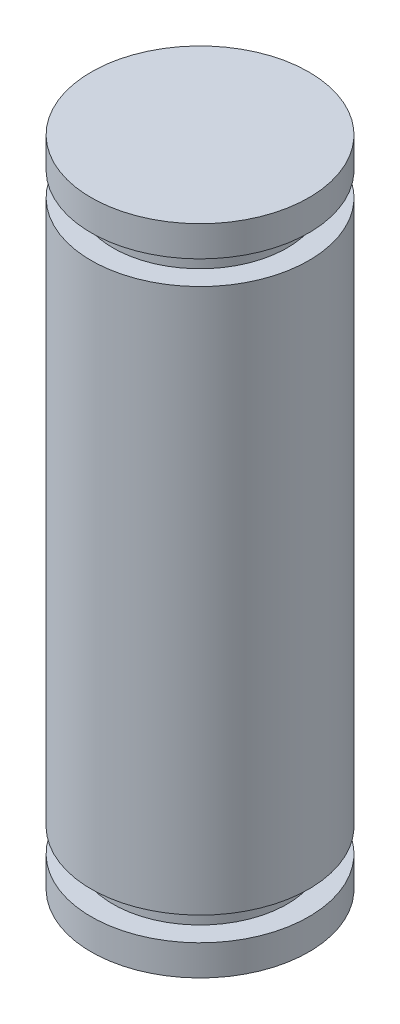
ISO-10303-21;
HEADER;
FILE_DESCRIPTION(('STEP AP214'),'2;1');
FILE_NAME('part.step','',(''),(''),'','','');
FILE_SCHEMA(('AUTOMOTIVE_DESIGN { 1 0 10303 214 1 1 1 1 }'));
ENDSEC;
DATA;
#1=APPLICATION_CONTEXT('core data for automotive mechanical design processes');
#2=APPLICATION_PROTOCOL_DEFINITION('international standard','automotive_design',2000,#1);
#3=PRODUCT_CONTEXT('',#1,'mechanical');
#4=PRODUCT('Part','Part','',(#3));
#5=PRODUCT_RELATED_PRODUCT_CATEGORY('part','',(#4));
#6=PRODUCT_DEFINITION_FORMATION('','',#4);
#7=PRODUCT_DEFINITION_CONTEXT('part definition',#1,'design');
#8=PRODUCT_DEFINITION('design','',#6,#7);
#9=PRODUCT_DEFINITION_SHAPE('','',#8);
#10=(LENGTH_UNIT() NAMED_UNIT(*) SI_UNIT(.MILLI.,.METRE.));
#11=(NAMED_UNIT(*) PLANE_ANGLE_UNIT() SI_UNIT($,.RADIAN.));
#12=(NAMED_UNIT(*) SI_UNIT($,.STERADIAN.) SOLID_ANGLE_UNIT());
#13=UNCERTAINTY_MEASURE_WITH_UNIT(LENGTH_MEASURE(1.E-05),#10,'distance_accuracy_value','');
#14=(GEOMETRIC_REPRESENTATION_CONTEXT(3) GLOBAL_UNCERTAINTY_ASSIGNED_CONTEXT((#13)) GLOBAL_UNIT_ASSIGNED_CONTEXT((#10,
#11,#12)) REPRESENTATION_CONTEXT('',''));
#15=CARTESIAN_POINT('',(0.,0.,0.));
#16=DIRECTION('',(0.,0.,1.));
#17=DIRECTION('',(1.,0.,0.));
#18=AXIS2_PLACEMENT_3D('',#15,#16,#17);
#19=CARTESIAN_POINT('',(0.,0.,0.));
#20=DIRECTION('',(0.,1.,0.));
#21=DIRECTION('',(0.,0.,1.));
#22=AXIS2_PLACEMENT_3D('',#19,#20,#21);
#23=PLANE('',#22);
#24=CARTESIAN_POINT('',(0.,0.,0.));
#25=DIRECTION('',(0.,-1.,0.));
#26=DIRECTION('',(0.,0.,-1.));
#27=AXIS2_PLACEMENT_3D('',#24,#25,#26);
#28=CIRCLE('',#27,5.);
#29=CARTESIAN_POINT('',(0.,0.,-5.));
#30=VERTEX_POINT('',#29);
#31=EDGE_CURVE('E10',#30,#30,#28,.T.);
#32=ORIENTED_EDGE('',*,*,#31,.T.);
#33=EDGE_LOOP('',(#32));
#34=FACE_BOUND('',#33,.T.);
#35=ADVANCED_FACE('F37',(#34),#23,.F.);
#36=CARTESIAN_POINT('',(0.,0.,0.));
#37=DIRECTION('',(0.,-1.,0.));
#38=DIRECTION('',(0.,0.,-1.));
#39=AXIS2_PLACEMENT_3D('',#36,#37,#38);
#40=CYLINDRICAL_SURFACE('',#39,5.);
#41=ORIENTED_EDGE('',*,*,#31,.F.);
#42=EDGE_LOOP('',(#41));
#43=FACE_BOUND('',#42,.T.);
#44=CARTESIAN_POINT('',(0.,1.4,0.));
#45=DIRECTION('',(0.,-1.,0.));
#46=DIRECTION('',(0.,0.,-1.));
#47=AXIS2_PLACEMENT_3D('',#44,#45,#46);
#48=CIRCLE('',#47,5.);
#49=CARTESIAN_POINT('',(0.,1.4,-5.));
#50=VERTEX_POINT('',#49);
#51=EDGE_CURVE('E44',#50,#50,#48,.T.);
#52=ORIENTED_EDGE('',*,*,#51,.T.);
#53=EDGE_LOOP('',(#52));
#54=FACE_BOUND('',#53,.T.);
#55=ADVANCED_FACE('F97',(#43,#54),#40,.T.);
#56=CARTESIAN_POINT('',(-5.,1.4,0.));
#57=DIRECTION('',(0.,-1.,0.));
#58=DIRECTION('',(0.,0.,-1.));
#59=AXIS2_PLACEMENT_3D('',#56,#57,#58);
#60=PLANE('',#59);
#61=ORIENTED_EDGE('',*,*,#51,.F.);
#62=EDGE_LOOP('',(#61));
#63=FACE_BOUND('',#62,.T.);
#64=CARTESIAN_POINT('',(0.,1.4,0.));
#65=DIRECTION('',(0.,-1.,0.));
#66=DIRECTION('',(0.,0.,-1.));
#67=AXIS2_PLACEMENT_3D('',#64,#65,#66);
#68=CIRCLE('',#67,4.);
#69=CARTESIAN_POINT('',(0.,1.4,-4.));
#70=VERTEX_POINT('',#69);
#71=EDGE_CURVE('E49',#70,#70,#68,.T.);
#72=ORIENTED_EDGE('',*,*,#71,.T.);
#73=EDGE_LOOP('',(#72));
#74=FACE_BOUND('',#73,.T.);
#75=ADVANCED_FACE('F101',(#63,#74),#60,.F.);
#76=CARTESIAN_POINT('',(0.,0.,0.));
#77=DIRECTION('',(0.,-1.,0.));
#78=DIRECTION('',(0.,0.,-1.));
#79=AXIS2_PLACEMENT_3D('',#76,#77,#78);
#80=CYLINDRICAL_SURFACE('',#79,4.);
#81=ORIENTED_EDGE('',*,*,#71,.F.);
#82=EDGE_LOOP('',(#81));
#83=FACE_BOUND('',#82,.T.);
#84=CARTESIAN_POINT('',(0.,2.5,0.));
#85=DIRECTION('',(0.,-1.,0.));
#86=DIRECTION('',(0.,0.,-1.));
#87=AXIS2_PLACEMENT_3D('',#84,#85,#86);
#88=CIRCLE('',#87,4.);
#89=CARTESIAN_POINT('',(0.,2.5,-4.));
#90=VERTEX_POINT('',#89);
#91=EDGE_CURVE('E54',#90,#90,#88,.T.);
#92=ORIENTED_EDGE('',*,*,#91,.T.);
#93=EDGE_LOOP('',(#92));
#94=FACE_BOUND('',#93,.T.);
#95=ADVANCED_FACE('F106',(#83,#94),#80,.T.);
#96=CARTESIAN_POINT('',(-4.,2.5,0.));
#97=DIRECTION('',(0.,1.,0.));
#98=DIRECTION('',(0.,0.,1.));
#99=AXIS2_PLACEMENT_3D('',#96,#97,#98);
#100=PLANE('',#99);
#101=ORIENTED_EDGE('',*,*,#91,.F.);
#102=EDGE_LOOP('',(#101));
#103=FACE_BOUND('',#102,.T.);
#104=CARTESIAN_POINT('',(0.,2.49999999999999,0.));
#105=DIRECTION('',(0.,-1.,0.));
#106=DIRECTION('',(0.,0.,-1.));
#107=AXIS2_PLACEMENT_3D('',#104,#105,#106);
#108=CIRCLE('',#107,5.);
#109=CARTESIAN_POINT('',(0.,2.49999999999999,-5.));
#110=VERTEX_POINT('',#109);
#111=EDGE_CURVE('E60',#110,#110,#108,.T.);
#112=ORIENTED_EDGE('',*,*,#111,.T.);
#113=EDGE_LOOP('',(#112));
#114=FACE_BOUND('',#113,.T.);
#115=ADVANCED_FACE('F112',(#103,#114),#100,.F.);
#116=CARTESIAN_POINT('',(0.,0.,0.));
#117=DIRECTION('',(0.,-1.,0.));
#118=DIRECTION('',(0.,0.,-1.));
#119=AXIS2_PLACEMENT_3D('',#116,#117,#118);
#120=CYLINDRICAL_SURFACE('',#119,5.);
#121=ORIENTED_EDGE('',*,*,#111,.F.);
#122=EDGE_LOOP('',(#121));
#123=FACE_BOUND('',#122,.T.);
#124=CARTESIAN_POINT('',(0.,27.5,0.));
#125=DIRECTION('',(0.,-1.,0.));
#126=DIRECTION('',(0.,0.,-1.));
#127=AXIS2_PLACEMENT_3D('',#124,#125,#126);
#128=CIRCLE('',#127,5.);
#129=CARTESIAN_POINT('',(0.,27.5,-5.));
#130=VERTEX_POINT('',#129);
#131=EDGE_CURVE('E64',#130,#130,#128,.T.);
#132=ORIENTED_EDGE('',*,*,#131,.T.);
#133=EDGE_LOOP('',(#132));
#134=FACE_BOUND('',#133,.T.);
#135=ADVANCED_FACE('F116',(#123,#134),#120,.T.);
#136=CARTESIAN_POINT('',(-5.,27.5,0.));
#137=DIRECTION('',(0.,-1.,0.));
#138=DIRECTION('',(0.,0.,-1.));
#139=AXIS2_PLACEMENT_3D('',#136,#137,#138);
#140=PLANE('',#139);
#141=ORIENTED_EDGE('',*,*,#131,.F.);
#142=EDGE_LOOP('',(#141));
#143=FACE_BOUND('',#142,.T.);
#144=CARTESIAN_POINT('',(0.,27.5,0.));
#145=DIRECTION('',(0.,-1.,0.));
#146=DIRECTION('',(0.,0.,-1.));
#147=AXIS2_PLACEMENT_3D('',#144,#145,#146);
#148=CIRCLE('',#147,4.);
#149=CARTESIAN_POINT('',(0.,27.5,-4.));
#150=VERTEX_POINT('',#149);
#151=EDGE_CURVE('E68',#150,#150,#148,.T.);
#152=ORIENTED_EDGE('',*,*,#151,.T.);
#153=EDGE_LOOP('',(#152));
#154=FACE_BOUND('',#153,.T.);
#155=ADVANCED_FACE('F120',(#143,#154),#140,.F.);
#156=CARTESIAN_POINT('',(0.,0.,0.));
#157=DIRECTION('',(0.,-1.,0.));
#158=DIRECTION('',(0.,0.,-1.));
#159=AXIS2_PLACEMENT_3D('',#156,#157,#158);
#160=CYLINDRICAL_SURFACE('',#159,4.);
#161=ORIENTED_EDGE('',*,*,#151,.F.);
#162=EDGE_LOOP('',(#161));
#163=FACE_BOUND('',#162,.T.);
#164=CARTESIAN_POINT('',(0.,28.6,0.));
#165=DIRECTION('',(0.,-1.,0.));
#166=DIRECTION('',(0.,0.,-1.));
#167=AXIS2_PLACEMENT_3D('',#164,#165,#166);
#168=CIRCLE('',#167,4.);
#169=CARTESIAN_POINT('',(0.,28.6,-4.));
#170=VERTEX_POINT('',#169);
#171=EDGE_CURVE('E72',#170,#170,#168,.T.);
#172=ORIENTED_EDGE('',*,*,#171,.T.);
#173=EDGE_LOOP('',(#172));
#174=FACE_BOUND('',#173,.T.);
#175=ADVANCED_FACE('F124',(#163,#174),#160,.T.);
#176=CARTESIAN_POINT('',(-4.,28.6,0.));
#177=DIRECTION('',(0.,1.,0.));
#178=DIRECTION('',(0.,0.,1.));
#179=AXIS2_PLACEMENT_3D('',#176,#177,#178);
#180=PLANE('',#179);
#181=ORIENTED_EDGE('',*,*,#171,.F.);
#182=EDGE_LOOP('',(#181));
#183=FACE_BOUND('',#182,.T.);
#184=CARTESIAN_POINT('',(0.,28.6,0.));
#185=DIRECTION('',(0.,-1.,0.));
#186=DIRECTION('',(0.,0.,-1.));
#187=AXIS2_PLACEMENT_3D('',#184,#185,#186);
#188=CIRCLE('',#187,5.);
#189=CARTESIAN_POINT('',(0.,28.6,-5.));
#190=VERTEX_POINT('',#189);
#191=EDGE_CURVE('E76',#190,#190,#188,.T.);
#192=ORIENTED_EDGE('',*,*,#191,.T.);
#193=EDGE_LOOP('',(#192));
#194=FACE_BOUND('',#193,.T.);
#195=ADVANCED_FACE('F93',(#183,#194),#180,.F.);
#196=CARTESIAN_POINT('',(0.,0.,0.));
#197=DIRECTION('',(0.,-1.,0.));
#198=DIRECTION('',(0.,0.,-1.));
#199=AXIS2_PLACEMENT_3D('',#196,#197,#198);
#200=CYLINDRICAL_SURFACE('',#199,5.);
#201=ORIENTED_EDGE('',*,*,#191,.F.);
#202=EDGE_LOOP('',(#201));
#203=FACE_BOUND('',#202,.T.);
#204=CARTESIAN_POINT('',(0.,30.,0.));
#205=DIRECTION('',(0.,-1.,0.));
#206=DIRECTION('',(0.,0.,-1.));
#207=AXIS2_PLACEMENT_3D('',#204,#205,#206);
#208=CIRCLE('',#207,5.);
#209=CARTESIAN_POINT('',(0.,30.,-5.));
#210=VERTEX_POINT('',#209);
#211=EDGE_CURVE('E80',#210,#210,#208,.T.);
#212=ORIENTED_EDGE('',*,*,#211,.T.);
#213=EDGE_LOOP('',(#212));
#214=FACE_BOUND('',#213,.T.);
#215=ADVANCED_FACE('F85',(#203,#214),#200,.T.);
#216=CARTESIAN_POINT('',(-5.,30.,0.));
#217=DIRECTION('',(0.,-1.,0.));
#218=DIRECTION('',(0.,0.,-1.));
#219=AXIS2_PLACEMENT_3D('',#216,#217,#218);
#220=PLANE('',#219);
#221=ORIENTED_EDGE('',*,*,#211,.F.);
#222=EDGE_LOOP('',(#221));
#223=FACE_BOUND('',#222,.T.);
#224=ADVANCED_FACE('F87',(#223),#220,.F.);
#225=CLOSED_SHELL('',(#35,#55,#75,#95,#115,#135,#155,#175,#195,#215,#224));
#226=MANIFOLD_SOLID_BREP('B2',#225);
#227=ADVANCED_BREP_SHAPE_REPRESENTATION('',(#18,#226),#14);
#228=SHAPE_DEFINITION_REPRESENTATION(#9,#227);
ENDSEC;
END-ISO-10303-21;
